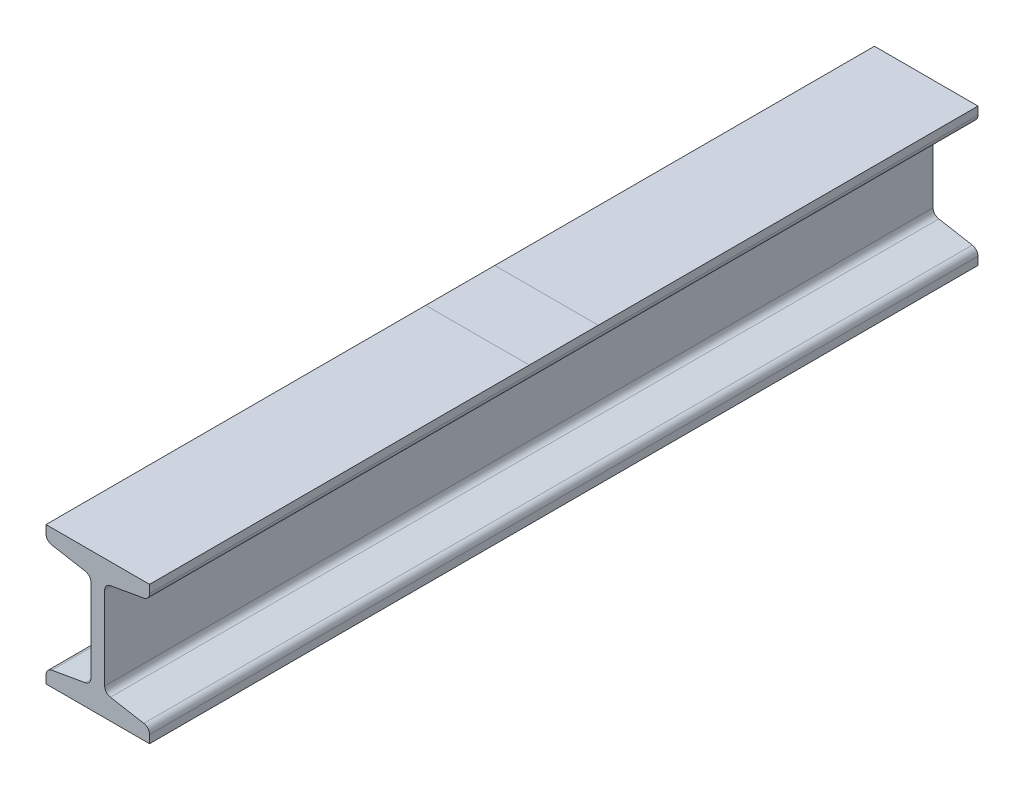
ISO-10303-21;
HEADER;
FILE_DESCRIPTION(('STEP AP214'),'2;1');
FILE_NAME('part.step','',(''),(''),'','','');
FILE_SCHEMA(('AUTOMOTIVE_DESIGN { 1 0 10303 214 1 1 1 1 }'));
ENDSEC;
DATA;
#1=APPLICATION_CONTEXT('core data for automotive mechanical design processes');
#2=APPLICATION_PROTOCOL_DEFINITION('international standard','automotive_design',2000,#1);
#3=PRODUCT_CONTEXT('',#1,'mechanical');
#4=PRODUCT('Part','Part','',(#3));
#5=PRODUCT_RELATED_PRODUCT_CATEGORY('part','',(#4));
#6=PRODUCT_DEFINITION_FORMATION('','',#4);
#7=PRODUCT_DEFINITION_CONTEXT('part definition',#1,'design');
#8=PRODUCT_DEFINITION('design','',#6,#7);
#9=PRODUCT_DEFINITION_SHAPE('','',#8);
#10=(LENGTH_UNIT() NAMED_UNIT(*) SI_UNIT(.MILLI.,.METRE.));
#11=(NAMED_UNIT(*) PLANE_ANGLE_UNIT() SI_UNIT($,.RADIAN.));
#12=(NAMED_UNIT(*) SI_UNIT($,.STERADIAN.) SOLID_ANGLE_UNIT());
#13=UNCERTAINTY_MEASURE_WITH_UNIT(LENGTH_MEASURE(1.E-05),#10,'distance_accuracy_value','');
#14=(GEOMETRIC_REPRESENTATION_CONTEXT(3) GLOBAL_UNCERTAINTY_ASSIGNED_CONTEXT((#13)) GLOBAL_UNIT_ASSIGNED_CONTEXT((#10,
#11,#12)) REPRESENTATION_CONTEXT('',''));
#15=CARTESIAN_POINT('',(0.,0.,0.));
#16=DIRECTION('',(0.,0.,1.));
#17=DIRECTION('',(1.,0.,0.));
#18=AXIS2_PLACEMENT_3D('',#15,#16,#17);
#19=CARTESIAN_POINT('',(37.5,-50.,600.));
#20=DIRECTION('',(0.,1.,0.));
#21=DIRECTION('',(0.,0.,1.));
#22=AXIS2_PLACEMENT_3D('',#19,#20,#21);
#23=PLANE('',#22);
#24=DIRECTION('',(-1.,0.,0.));
#25=VECTOR('',#24,1.);
#26=CARTESIAN_POINT('',(37.4999999999997,-50.,40.));
#27=LINE('',#26,#25);
#28=CARTESIAN_POINT('',(37.5,-50.,40.));
#29=VERTEX_POINT('',#28);
#30=CARTESIAN_POINT('',(-37.5,-50.,40.));
#31=VERTEX_POINT('',#30);
#32=EDGE_CURVE('E365',#29,#31,#27,.T.);
#33=ORIENTED_EDGE('',*,*,#32,.F.);
#34=DIRECTION('',(0.,0.,-1.));
#35=VECTOR('',#34,1.);
#36=CARTESIAN_POINT('',(37.5,-50.,600.));
#37=LINE('',#36,#35);
#38=CARTESIAN_POINT('',(37.5,-50.,560.));
#39=VERTEX_POINT('',#38);
#40=EDGE_CURVE('E274',#39,#29,#37,.T.);
#41=ORIENTED_EDGE('',*,*,#40,.F.);
#42=DIRECTION('',(1.,0.,0.));
#43=VECTOR('',#42,1.);
#44=CARTESIAN_POINT('',(37.5,-50.,560.));
#45=LINE('',#44,#43);
#46=CARTESIAN_POINT('',(-37.5,-50.,560.));
#47=VERTEX_POINT('',#46);
#48=EDGE_CURVE('E361',#47,#39,#45,.T.);
#49=ORIENTED_EDGE('',*,*,#48,.F.);
#50=DIRECTION('',(0.,0.,-1.));
#51=VECTOR('',#50,1.);
#52=CARTESIAN_POINT('',(-37.5,-50.,600.));
#53=LINE('',#52,#51);
#54=EDGE_CURVE('E256',#47,#31,#53,.T.);
#55=ORIENTED_EDGE('',*,*,#54,.T.);
#56=EDGE_LOOP('',(#33,#41,#49,#55));
#57=FACE_BOUND('',#56,.T.);
#58=ADVANCED_FACE('F51',(#57),#23,.F.);
#59=CARTESIAN_POINT('',(37.5,-50.,0.));
#60=VERTEX_POINT('',#59);
#61=EDGE_CURVE('E275',#29,#60,#37,.T.);
#62=ORIENTED_EDGE('',*,*,#61,.F.);
#63=ORIENTED_EDGE('',*,*,#32,.T.);
#64=CARTESIAN_POINT('',(-37.5,-50.,0.));
#65=VERTEX_POINT('',#64);
#66=EDGE_CURVE('E257',#31,#65,#53,.T.);
#67=ORIENTED_EDGE('',*,*,#66,.T.);
#68=DIRECTION('',(1.,0.,0.));
#69=VECTOR('',#68,1.);
#70=CARTESIAN_POINT('',(37.5,-50.,0.));
#71=LINE('',#70,#69);
#72=EDGE_CURVE('E328',#65,#60,#71,.T.);
#73=ORIENTED_EDGE('',*,*,#72,.T.);
#74=EDGE_LOOP('',(#62,#63,#67,#73));
#75=FACE_BOUND('',#74,.T.);
#76=ADVANCED_FACE('F543',(#75),#23,.F.);
#77=CARTESIAN_POINT('',(-37.5,50.,600.));
#78=DIRECTION('',(0.,-1.,0.));
#79=DIRECTION('',(0.,0.,-1.));
#80=AXIS2_PLACEMENT_3D('',#77,#78,#79);
#81=PLANE('',#80);
#82=DIRECTION('',(-1.,0.,0.));
#83=VECTOR('',#82,1.);
#84=CARTESIAN_POINT('',(-37.5,50.,275.));
#85=LINE('',#84,#83);
#86=CARTESIAN_POINT('',(37.5,50.,275.));
#87=VERTEX_POINT('',#86);
#88=CARTESIAN_POINT('',(-37.5,50.,275.));
#89=VERTEX_POINT('',#88);
#90=EDGE_CURVE('E247',#87,#89,#85,.T.);
#91=ORIENTED_EDGE('',*,*,#90,.F.);
#92=DIRECTION('',(0.,0.,-1.));
#93=VECTOR('',#92,1.);
#94=CARTESIAN_POINT('',(37.5,50.,600.));
#95=LINE('',#94,#93);
#96=CARTESIAN_POINT('',(37.5,50.,0.));
#97=VERTEX_POINT('',#96);
#98=EDGE_CURVE('E289',#87,#97,#95,.T.);
#99=ORIENTED_EDGE('',*,*,#98,.T.);
#100=DIRECTION('',(-1.,0.,0.));
#101=VECTOR('',#100,1.);
#102=CARTESIAN_POINT('',(-37.5,50.,0.));
#103=LINE('',#102,#101);
#104=CARTESIAN_POINT('',(-37.5,50.,0.));
#105=VERTEX_POINT('',#104);
#106=EDGE_CURVE('E307',#97,#105,#103,.T.);
#107=ORIENTED_EDGE('',*,*,#106,.T.);
#108=DIRECTION('',(0.,0.,-1.));
#109=VECTOR('',#108,1.);
#110=CARTESIAN_POINT('',(-37.5,50.,600.));
#111=LINE('',#110,#109);
#112=EDGE_CURVE('E244',#89,#105,#111,.T.);
#113=ORIENTED_EDGE('',*,*,#112,.F.);
#114=EDGE_LOOP('',(#91,#99,#107,#113));
#115=FACE_BOUND('',#114,.T.);
#116=ADVANCED_FACE('F357',(#115),#81,.F.);
#117=DIRECTION('',(1.,0.,0.));
#118=VECTOR('',#117,1.);
#119=CARTESIAN_POINT('',(-37.5,50.,325.));
#120=LINE('',#119,#118);
#121=CARTESIAN_POINT('',(-37.5,50.,325.));
#122=VERTEX_POINT('',#121);
#123=CARTESIAN_POINT('',(37.5,50.,325.));
#124=VERTEX_POINT('',#123);
#125=EDGE_CURVE('E239',#122,#124,#120,.T.);
#126=ORIENTED_EDGE('',*,*,#125,.F.);
#127=CARTESIAN_POINT('',(-37.5,50.,600.));
#128=VERTEX_POINT('',#127);
#129=EDGE_CURVE('E220',#128,#122,#111,.T.);
#130=ORIENTED_EDGE('',*,*,#129,.F.);
#131=DIRECTION('',(-1.,0.,0.));
#132=VECTOR('',#131,1.);
#133=CARTESIAN_POINT('',(-37.5,50.,600.));
#134=LINE('',#133,#132);
#135=CARTESIAN_POINT('',(37.5,50.,600.));
#136=VERTEX_POINT('',#135);
#137=EDGE_CURVE('E226',#136,#128,#134,.T.);
#138=ORIENTED_EDGE('',*,*,#137,.F.);
#139=EDGE_CURVE('E284',#136,#124,#95,.T.);
#140=ORIENTED_EDGE('',*,*,#139,.T.);
#141=EDGE_LOOP('',(#126,#130,#138,#140));
#142=FACE_BOUND('',#141,.T.);
#143=ADVANCED_FACE('F238',(#142),#81,.F.);
#144=EDGE_CURVE('E288',#124,#87,#95,.T.);
#145=ORIENTED_EDGE('',*,*,#144,.T.);
#146=ORIENTED_EDGE('',*,*,#90,.T.);
#147=EDGE_CURVE('E242',#122,#89,#111,.T.);
#148=ORIENTED_EDGE('',*,*,#147,.F.);
#149=ORIENTED_EDGE('',*,*,#125,.T.);
#150=EDGE_LOOP('',(#145,#146,#148,#149));
#151=FACE_BOUND('',#150,.T.);
#152=ADVANCED_FACE('F359',(#151),#81,.F.);
#153=CARTESIAN_POINT('',(-37.5,50.,600.));
#154=DIRECTION('',(1.,0.,0.));
#155=DIRECTION('',(0.,1.,0.));
#156=AXIS2_PLACEMENT_3D('',#153,#154,#155);
#157=PLANE('',#156);
#158=DIRECTION('',(0.,-1.,0.));
#159=VECTOR('',#158,1.);
#160=CARTESIAN_POINT('',(-37.5,50.,0.));
#161=LINE('',#160,#159);
#162=CARTESIAN_POINT('',(-37.5,44.1954981558864,0.));
#163=VERTEX_POINT('',#162);
#164=EDGE_CURVE('E310',#105,#163,#161,.T.);
#165=ORIENTED_EDGE('',*,*,#164,.T.);
#166=DIRECTION('',(0.,0.,-1.));
#167=VECTOR('',#166,1.);
#168=CARTESIAN_POINT('',(-37.5,44.1954981558864,600.));
#169=LINE('',#168,#167);
#170=CARTESIAN_POINT('',(-37.5,44.1954981558864,600.));
#171=VERTEX_POINT('',#170);
#172=EDGE_CURVE('E222',#163,#171,#169,.F.);
#173=ORIENTED_EDGE('',*,*,#172,.T.);
#174=DIRECTION('',(0.,-1.,0.));
#175=VECTOR('',#174,1.);
#176=CARTESIAN_POINT('',(-37.5,50.,600.));
#177=LINE('',#176,#175);
#178=EDGE_CURVE('E214',#128,#171,#177,.T.);
#179=ORIENTED_EDGE('',*,*,#178,.F.);
#180=ORIENTED_EDGE('',*,*,#129,.T.);
#181=ORIENTED_EDGE('',*,*,#147,.T.);
#182=ORIENTED_EDGE('',*,*,#112,.T.);
#183=EDGE_LOOP('',(#165,#173,#179,#180,#181,#182));
#184=FACE_BOUND('',#183,.T.);
#185=ADVANCED_FACE('F217',(#184),#157,.F.);
#186=CARTESIAN_POINT('',(-37.5,40.,600.));
#187=DIRECTION('',(0.173648177666926,0.984807753012209,0.));
#188=DIRECTION('',(-0.984807753012209,0.173648177666926,0.));
#189=AXIS2_PLACEMENT_3D('',#186,#187,#188);
#190=PLANE('',#189);
#191=DIRECTION('',(0.984807753012209,-0.173648177666926,0.));
#192=VECTOR('',#191,1.);
#193=CARTESIAN_POINT('',(-37.5,40.,0.));
#194=LINE('',#193,#192);
#195=CARTESIAN_POINT('',(-33.3682408883346,39.2714593908254,0.));
#196=VERTEX_POINT('',#195);
#197=CARTESIAN_POINT('',(-9.13175911166537,34.9979137361497,0.));
#198=VERTEX_POINT('',#197);
#199=EDGE_CURVE('E313',#196,#198,#194,.T.);
#200=ORIENTED_EDGE('',*,*,#199,.T.);
#201=DIRECTION('',(0.,0.,-1.));
#202=VECTOR('',#201,1.);
#203=CARTESIAN_POINT('',(-9.13175911166537,34.9979137361497,600.));
#204=LINE('',#203,#202);
#205=CARTESIAN_POINT('',(-9.13175911166537,34.9979137361497,600.));
#206=VERTEX_POINT('',#205);
#207=EDGE_CURVE('E445',#198,#206,#204,.F.);
#208=ORIENTED_EDGE('',*,*,#207,.T.);
#209=DIRECTION('',(0.984807753012209,-0.173648177666926,0.));
#210=VECTOR('',#209,1.);
#211=CARTESIAN_POINT('',(-37.5,40.,600.));
#212=LINE('',#211,#210);
#213=CARTESIAN_POINT('',(-33.3682408883346,39.2714593908254,600.));
#214=VERTEX_POINT('',#213);
#215=EDGE_CURVE('E225',#214,#206,#212,.T.);
#216=ORIENTED_EDGE('',*,*,#215,.F.);
#217=DIRECTION('',(0.,0.,-1.));
#218=VECTOR('',#217,1.);
#219=CARTESIAN_POINT('',(-33.3682408883346,39.2714593908254,600.));
#220=LINE('',#219,#218);
#221=EDGE_CURVE('E441',#214,#196,#220,.T.);
#222=ORIENTED_EDGE('',*,*,#221,.T.);
#223=EDGE_LOOP('',(#200,#208,#216,#222));
#224=FACE_BOUND('',#223,.T.);
#225=ADVANCED_FACE('F476',(#224),#190,.F.);
#226=CARTESIAN_POINT('',(-5.,34.269373126975,600.));
#227=DIRECTION('',(1.,0.,0.));
#228=DIRECTION('',(0.,1.,0.));
#229=AXIS2_PLACEMENT_3D('',#226,#227,#228);
#230=PLANE('',#229);
#231=DIRECTION('',(0.,-1.,0.));
#232=VECTOR('',#231,1.);
#233=CARTESIAN_POINT('',(-5.,34.269373126975,0.));
#234=LINE('',#233,#232);
#235=CARTESIAN_POINT('',(-5.,30.0738749710886,0.));
#236=VERTEX_POINT('',#235);
#237=CARTESIAN_POINT('',(-4.99999999999999,-30.0738749710886,0.));
#238=VERTEX_POINT('',#237);
#239=EDGE_CURVE('E317',#236,#238,#234,.T.);
#240=ORIENTED_EDGE('',*,*,#239,.T.);
#241=DIRECTION('',(0.,0.,-1.));
#242=VECTOR('',#241,1.);
#243=CARTESIAN_POINT('',(-4.99999999999999,-30.0738749710886,600.));
#244=LINE('',#243,#242);
#245=CARTESIAN_POINT('',(-4.99999999999999,-30.0738749710886,600.));
#246=VERTEX_POINT('',#245);
#247=EDGE_CURVE('E415',#238,#246,#244,.F.);
#248=ORIENTED_EDGE('',*,*,#247,.T.);
#249=DIRECTION('',(0.,-1.,0.));
#250=VECTOR('',#249,1.);
#251=CARTESIAN_POINT('',(-5.,34.269373126975,600.));
#252=LINE('',#251,#250);
#253=CARTESIAN_POINT('',(-5.,30.0738749710886,600.));
#254=VERTEX_POINT('',#253);
#255=EDGE_CURVE('E484',#254,#246,#252,.T.);
#256=ORIENTED_EDGE('',*,*,#255,.F.);
#257=DIRECTION('',(0.,0.,-1.));
#258=VECTOR('',#257,1.);
#259=CARTESIAN_POINT('',(-5.,30.0738749710886,2.22044604925031E-13));
#260=LINE('',#259,#258);
#261=EDGE_CURVE('E411',#254,#236,#260,.T.);
#262=ORIENTED_EDGE('',*,*,#261,.T.);
#263=EDGE_LOOP('',(#240,#248,#256,#262));
#264=FACE_BOUND('',#263,.T.);
#265=ADVANCED_FACE('F487',(#264),#230,.F.);
#266=CARTESIAN_POINT('',(-4.99999999999999,-34.269373126975,600.));
#267=DIRECTION('',(0.173648177666926,-0.984807753012209,0.));
#268=DIRECTION('',(0.984807753012209,0.173648177666926,0.));
#269=AXIS2_PLACEMENT_3D('',#266,#267,#268);
#270=PLANE('',#269);
#271=DIRECTION('',(-0.984807753012209,-0.173648177666926,0.));
#272=VECTOR('',#271,1.);
#273=CARTESIAN_POINT('',(-4.99999999999999,-34.269373126975,0.));
#274=LINE('',#273,#272);
#275=CARTESIAN_POINT('',(-9.13175911166536,-34.9979137361497,0.));
#276=VERTEX_POINT('',#275);
#277=CARTESIAN_POINT('',(-33.3682408883346,-39.2714593908254,0.));
#278=VERTEX_POINT('',#277);
#279=EDGE_CURVE('E321',#276,#278,#274,.T.);
#280=ORIENTED_EDGE('',*,*,#279,.T.);
#281=DIRECTION('',(0.,0.,-1.));
#282=VECTOR('',#281,1.);
#283=CARTESIAN_POINT('',(-33.3682408883346,-39.2714593908254,600.));
#284=LINE('',#283,#282);
#285=CARTESIAN_POINT('',(-33.3682408883346,-39.2714593908254,600.));
#286=VERTEX_POINT('',#285);
#287=EDGE_CURVE('E397',#278,#286,#284,.F.);
#288=ORIENTED_EDGE('',*,*,#287,.T.);
#289=DIRECTION('',(-0.984807753012209,-0.173648177666926,0.));
#290=VECTOR('',#289,1.);
#291=CARTESIAN_POINT('',(-4.99999999999999,-34.269373126975,600.));
#292=LINE('',#291,#290);
#293=CARTESIAN_POINT('',(-9.13175911166536,-34.9979137361497,600.));
#294=VERTEX_POINT('',#293);
#295=EDGE_CURVE('E490',#294,#286,#292,.T.);
#296=ORIENTED_EDGE('',*,*,#295,.F.);
#297=DIRECTION('',(0.,0.,-1.));
#298=VECTOR('',#297,1.);
#299=CARTESIAN_POINT('',(-9.13175911166536,-34.9979137361497,0.));
#300=LINE('',#299,#298);
#301=EDGE_CURVE('E393',#294,#276,#300,.T.);
#302=ORIENTED_EDGE('',*,*,#301,.T.);
#303=EDGE_LOOP('',(#280,#288,#296,#302));
#304=FACE_BOUND('',#303,.T.);
#305=ADVANCED_FACE('F554',(#304),#270,.F.);
#306=CARTESIAN_POINT('',(-37.5,-40.,600.));
#307=DIRECTION('',(1.,0.,0.));
#308=DIRECTION('',(0.,0.,-1.));
#309=AXIS2_PLACEMENT_3D('',#306,#307,#308);
#310=PLANE('',#309);
#311=DIRECTION('',(0.,-1.,0.));
#312=VECTOR('',#311,1.);
#313=CARTESIAN_POINT('',(-37.5,-40.,600.));
#314=LINE('',#313,#312);
#315=CARTESIAN_POINT('',(-37.5,-44.1954981558864,600.));
#316=VERTEX_POINT('',#315);
#317=CARTESIAN_POINT('',(-37.5,-50.,600.));
#318=VERTEX_POINT('',#317);
#319=EDGE_CURVE('E494',#316,#318,#314,.T.);
#320=ORIENTED_EDGE('',*,*,#319,.F.);
#321=DIRECTION('',(0.,0.,-1.));
#322=VECTOR('',#321,1.);
#323=CARTESIAN_POINT('',(-37.5,-44.1954981558864,600.));
#324=LINE('',#323,#322);
#325=CARTESIAN_POINT('',(-37.5,-44.1954981558864,0.));
#326=VERTEX_POINT('',#325);
#327=EDGE_CURVE('E378',#316,#326,#324,.T.);
#328=ORIENTED_EDGE('',*,*,#327,.T.);
#329=DIRECTION('',(0.,-1.,0.));
#330=VECTOR('',#329,1.);
#331=CARTESIAN_POINT('',(-37.5,-40.,0.));
#332=LINE('',#331,#330);
#333=EDGE_CURVE('E325',#326,#65,#332,.T.);
#334=ORIENTED_EDGE('',*,*,#333,.T.);
#335=ORIENTED_EDGE('',*,*,#66,.F.);
#336=ORIENTED_EDGE('',*,*,#54,.F.);
#337=EDGE_CURVE('E251',#318,#47,#53,.T.);
#338=ORIENTED_EDGE('',*,*,#337,.F.);
#339=EDGE_LOOP('',(#320,#328,#334,#335,#336,#338));
#340=FACE_BOUND('',#339,.T.);
#341=ADVANCED_FACE('F546',(#340),#310,.F.);
#342=ORIENTED_EDGE('',*,*,#337,.T.);
#343=ORIENTED_EDGE('',*,*,#48,.T.);
#344=CARTESIAN_POINT('',(37.5,-50.,600.));
#345=VERTEX_POINT('',#344);
#346=EDGE_CURVE('E267',#345,#39,#37,.T.);
#347=ORIENTED_EDGE('',*,*,#346,.F.);
#348=DIRECTION('',(1.,0.,0.));
#349=VECTOR('',#348,1.);
#350=CARTESIAN_POINT('',(37.5,-50.,600.));
#351=LINE('',#350,#349);
#352=EDGE_CURVE('E500',#318,#345,#351,.T.);
#353=ORIENTED_EDGE('',*,*,#352,.F.);
#354=EDGE_LOOP('',(#342,#343,#347,#353));
#355=FACE_BOUND('',#354,.T.);
#356=ADVANCED_FACE('F539',(#355),#23,.F.);
#357=CARTESIAN_POINT('',(37.5,-40.,600.));
#358=DIRECTION('',(-1.,0.,0.));
#359=DIRECTION('',(0.,-1.,0.));
#360=AXIS2_PLACEMENT_3D('',#357,#358,#359);
#361=PLANE('',#360);
#362=DIRECTION('',(0.,1.,0.));
#363=VECTOR('',#362,1.);
#364=CARTESIAN_POINT('',(37.5,-40.,0.));
#365=LINE('',#364,#363);
#366=CARTESIAN_POINT('',(37.5,-44.1954981558864,0.));
#367=VERTEX_POINT('',#366);
#368=EDGE_CURVE('E331',#60,#367,#365,.T.);
#369=ORIENTED_EDGE('',*,*,#368,.T.);
#370=DIRECTION('',(0.,0.,-1.));
#371=VECTOR('',#370,1.);
#372=CARTESIAN_POINT('',(37.5,-44.1954981558864,600.));
#373=LINE('',#372,#371);
#374=CARTESIAN_POINT('',(37.5,-44.1954981558864,600.));
#375=VERTEX_POINT('',#374);
#376=EDGE_CURVE('E425',#367,#375,#373,.F.);
#377=ORIENTED_EDGE('',*,*,#376,.T.);
#378=DIRECTION('',(0.,1.,0.));
#379=VECTOR('',#378,1.);
#380=CARTESIAN_POINT('',(37.5,-40.,600.));
#381=LINE('',#380,#379);
#382=EDGE_CURVE('E503',#345,#375,#381,.T.);
#383=ORIENTED_EDGE('',*,*,#382,.F.);
#384=ORIENTED_EDGE('',*,*,#346,.T.);
#385=ORIENTED_EDGE('',*,*,#40,.T.);
#386=ORIENTED_EDGE('',*,*,#61,.T.);
#387=EDGE_LOOP('',(#369,#377,#383,#384,#385,#386));
#388=FACE_BOUND('',#387,.T.);
#389=ADVANCED_FACE('F537',(#388),#361,.F.);
#390=CARTESIAN_POINT('',(5.00000000000001,-34.269373126975,600.));
#391=DIRECTION('',(-0.173648177666926,-0.984807753012209,0.));
#392=DIRECTION('',(0.984807753012209,-0.173648177666926,0.));
#393=AXIS2_PLACEMENT_3D('',#390,#391,#392);
#394=PLANE('',#393);
#395=DIRECTION('',(-0.984807753012209,0.173648177666926,0.));
#396=VECTOR('',#395,1.);
#397=CARTESIAN_POINT('',(5.00000000000001,-34.269373126975,600.));
#398=LINE('',#397,#396);
#399=CARTESIAN_POINT('',(33.3682408883346,-39.2714593908254,600.));
#400=VERTEX_POINT('',#399);
#401=CARTESIAN_POINT('',(9.13175911166538,-34.9979137361497,600.));
#402=VERTEX_POINT('',#401);
#403=EDGE_CURVE('E507',#400,#402,#398,.T.);
#404=ORIENTED_EDGE('',*,*,#403,.F.);
#405=DIRECTION('',(0.,0.,-1.));
#406=VECTOR('',#405,1.);
#407=CARTESIAN_POINT('',(33.3682408883346,-39.2714593908254,600.));
#408=LINE('',#407,#406);
#409=CARTESIAN_POINT('',(33.3682408883346,-39.2714593908254,0.));
#410=VERTEX_POINT('',#409);
#411=EDGE_CURVE('E421',#400,#410,#408,.T.);
#412=ORIENTED_EDGE('',*,*,#411,.T.);
#413=DIRECTION('',(-0.984807753012209,0.173648177666926,0.));
#414=VECTOR('',#413,1.);
#415=CARTESIAN_POINT('',(5.00000000000001,-34.269373126975,0.));
#416=LINE('',#415,#414);
#417=CARTESIAN_POINT('',(9.13175911166538,-34.9979137361497,0.));
#418=VERTEX_POINT('',#417);
#419=EDGE_CURVE('E334',#410,#418,#416,.T.);
#420=ORIENTED_EDGE('',*,*,#419,.T.);
#421=DIRECTION('',(0.,0.,-1.));
#422=VECTOR('',#421,1.);
#423=CARTESIAN_POINT('',(9.13175911166538,-34.9979137361497,600.));
#424=LINE('',#423,#422);
#425=EDGE_CURVE('E418',#418,#402,#424,.F.);
#426=ORIENTED_EDGE('',*,*,#425,.T.);
#427=EDGE_LOOP('',(#404,#412,#420,#426));
#428=FACE_BOUND('',#427,.T.);
#429=ADVANCED_FACE('F530',(#428),#394,.F.);
#430=CARTESIAN_POINT('',(5.,34.269373126975,600.));
#431=DIRECTION('',(-1.,0.,0.));
#432=DIRECTION('',(0.,-1.,0.));
#433=AXIS2_PLACEMENT_3D('',#430,#431,#432);
#434=PLANE('',#433);
#435=DIRECTION('',(0.,1.,0.));
#436=VECTOR('',#435,1.);
#437=CARTESIAN_POINT('',(5.,34.269373126975,600.));
#438=LINE('',#437,#436);
#439=CARTESIAN_POINT('',(5.00000000000001,-30.0738749710886,600.));
#440=VERTEX_POINT('',#439);
#441=CARTESIAN_POINT('',(5.,30.0738749710886,600.));
#442=VERTEX_POINT('',#441);
#443=EDGE_CURVE('E303',#440,#442,#438,.T.);
#444=ORIENTED_EDGE('',*,*,#443,.F.);
#445=DIRECTION('',(0.,0.,-1.));
#446=VECTOR('',#445,1.);
#447=CARTESIAN_POINT('',(5.00000000000001,-30.0738749710886,2.22044604925031E-13));
#448=LINE('',#447,#446);
#449=CARTESIAN_POINT('',(5.00000000000001,-30.0738749710886,0.));
#450=VERTEX_POINT('',#449);
#451=EDGE_CURVE('E431',#440,#450,#448,.T.);
#452=ORIENTED_EDGE('',*,*,#451,.T.);
#453=DIRECTION('',(0.,1.,0.));
#454=VECTOR('',#453,1.);
#455=CARTESIAN_POINT('',(5.,34.269373126975,0.));
#456=LINE('',#455,#454);
#457=CARTESIAN_POINT('',(5.,30.0738749710886,0.));
#458=VERTEX_POINT('',#457);
#459=EDGE_CURVE('E338',#450,#458,#456,.T.);
#460=ORIENTED_EDGE('',*,*,#459,.T.);
#461=DIRECTION('',(0.,0.,-1.));
#462=VECTOR('',#461,1.);
#463=CARTESIAN_POINT('',(5.,30.0738749710886,600.));
#464=LINE('',#463,#462);
#465=EDGE_CURVE('E428',#458,#442,#464,.F.);
#466=ORIENTED_EDGE('',*,*,#465,.T.);
#467=EDGE_LOOP('',(#444,#452,#460,#466));
#468=FACE_BOUND('',#467,.T.);
#469=ADVANCED_FACE('F523',(#468),#434,.F.);
#470=CARTESIAN_POINT('',(37.5,40.,600.));
#471=DIRECTION('',(-0.173648177666926,0.984807753012209,0.));
#472=DIRECTION('',(-0.984807753012209,-0.173648177666926,0.));
#473=AXIS2_PLACEMENT_3D('',#470,#471,#472);
#474=PLANE('',#473);
#475=DIRECTION('',(0.984807753012209,0.173648177666926,0.));
#476=VECTOR('',#475,1.);
#477=CARTESIAN_POINT('',(37.5,40.,600.));
#478=LINE('',#477,#476);
#479=CARTESIAN_POINT('',(9.13175911166537,34.9979137361497,600.));
#480=VERTEX_POINT('',#479);
#481=CARTESIAN_POINT('',(33.3682408883346,39.2714593908254,600.));
#482=VERTEX_POINT('',#481);
#483=EDGE_CURVE('E300',#480,#482,#478,.T.);
#484=ORIENTED_EDGE('',*,*,#483,.F.);
#485=DIRECTION('',(0.,0.,-1.));
#486=VECTOR('',#485,1.);
#487=CARTESIAN_POINT('',(9.13175911166537,34.9979137361497,0.));
#488=LINE('',#487,#486);
#489=CARTESIAN_POINT('',(9.13175911166537,34.9979137361497,0.));
#490=VERTEX_POINT('',#489);
#491=EDGE_CURVE('E437',#480,#490,#488,.T.);
#492=ORIENTED_EDGE('',*,*,#491,.T.);
#493=DIRECTION('',(0.984807753012209,0.173648177666926,0.));
#494=VECTOR('',#493,1.);
#495=CARTESIAN_POINT('',(37.5,40.,0.));
#496=LINE('',#495,#494);
#497=CARTESIAN_POINT('',(33.3682408883346,39.2714593908254,0.));
#498=VERTEX_POINT('',#497);
#499=EDGE_CURVE('E342',#490,#498,#496,.T.);
#500=ORIENTED_EDGE('',*,*,#499,.T.);
#501=DIRECTION('',(0.,0.,-1.));
#502=VECTOR('',#501,1.);
#503=CARTESIAN_POINT('',(33.3682408883346,39.2714593908254,600.));
#504=LINE('',#503,#502);
#505=EDGE_CURVE('E75',#498,#482,#504,.F.);
#506=ORIENTED_EDGE('',*,*,#505,.T.);
#507=EDGE_LOOP('',(#484,#492,#500,#506));
#508=FACE_BOUND('',#507,.T.);
#509=ADVANCED_FACE('F521',(#508),#474,.F.);
#510=CARTESIAN_POINT('',(37.5,50.,600.));
#511=DIRECTION('',(-1.,0.,0.));
#512=DIRECTION('',(0.,-1.,0.));
#513=AXIS2_PLACEMENT_3D('',#510,#511,#512);
#514=PLANE('',#513);
#515=DIRECTION('',(0.,1.,0.));
#516=VECTOR('',#515,1.);
#517=CARTESIAN_POINT('',(37.5,50.,600.));
#518=LINE('',#517,#516);
#519=CARTESIAN_POINT('',(37.5,44.1954981558864,600.));
#520=VERTEX_POINT('',#519);
#521=EDGE_CURVE('E231',#520,#136,#518,.T.);
#522=ORIENTED_EDGE('',*,*,#521,.F.);
#523=DIRECTION('',(0.,0.,-1.));
#524=VECTOR('',#523,1.);
#525=CARTESIAN_POINT('',(37.5,44.1954981558864,600.));
#526=LINE('',#525,#524);
#527=CARTESIAN_POINT('',(37.5,44.1954981558864,0.));
#528=VERTEX_POINT('',#527);
#529=EDGE_CURVE('E351',#520,#528,#526,.T.);
#530=ORIENTED_EDGE('',*,*,#529,.T.);
#531=DIRECTION('',(0.,1.,0.));
#532=VECTOR('',#531,1.);
#533=CARTESIAN_POINT('',(37.5,50.,0.));
#534=LINE('',#533,#532);
#535=EDGE_CURVE('E236',#528,#97,#534,.T.);
#536=ORIENTED_EDGE('',*,*,#535,.T.);
#537=ORIENTED_EDGE('',*,*,#98,.F.);
#538=ORIENTED_EDGE('',*,*,#144,.F.);
#539=ORIENTED_EDGE('',*,*,#139,.F.);
#540=EDGE_LOOP('',(#522,#530,#536,#537,#538,#539));
#541=FACE_BOUND('',#540,.T.);
#542=ADVANCED_FACE('F348',(#541),#514,.F.);
#543=CARTESIAN_POINT('',(0.,0.,600.));
#544=DIRECTION('',(0.,0.,-1.));
#545=DIRECTION('',(-1.,0.,0.));
#546=AXIS2_PLACEMENT_3D('',#543,#544,#545);
#547=PLANE('',#546);
#548=ORIENTED_EDGE('',*,*,#295,.T.);
#549=CARTESIAN_POINT('',(-32.5,-44.1954981558864,600.));
#550=DIRECTION('',(0.,0.,-1.));
#551=DIRECTION('',(-1.,0.,0.));
#552=AXIS2_PLACEMENT_3D('',#549,#550,#551);
#553=CIRCLE('',#552,5.);
#554=EDGE_CURVE('E408',#286,#316,#553,.F.);
#555=ORIENTED_EDGE('',*,*,#554,.T.);
#556=ORIENTED_EDGE('',*,*,#319,.T.);
#557=ORIENTED_EDGE('',*,*,#352,.T.);
#558=ORIENTED_EDGE('',*,*,#382,.T.);
#559=CARTESIAN_POINT('',(32.5,-44.1954981558864,600.));
#560=DIRECTION('',(0.,0.,-1.));
#561=DIRECTION('',(-1.,0.,0.));
#562=AXIS2_PLACEMENT_3D('',#559,#560,#561);
#563=CIRCLE('',#562,5.);
#564=EDGE_CURVE('E405',#375,#400,#563,.F.);
#565=ORIENTED_EDGE('',*,*,#564,.T.);
#566=ORIENTED_EDGE('',*,*,#403,.T.);
#567=CARTESIAN_POINT('',(10.,-30.0738749710886,600.));
#568=DIRECTION('',(0.,0.,-1.));
#569=DIRECTION('',(-1.,0.,0.));
#570=AXIS2_PLACEMENT_3D('',#567,#568,#569);
#571=CIRCLE('',#570,5.);
#572=EDGE_CURVE('E461',#402,#440,#571,.T.);
#573=ORIENTED_EDGE('',*,*,#572,.T.);
#574=ORIENTED_EDGE('',*,*,#443,.T.);
#575=CARTESIAN_POINT('',(10.,30.0738749710886,600.));
#576=DIRECTION('',(0.,0.,-1.));
#577=DIRECTION('',(-1.,0.,0.));
#578=AXIS2_PLACEMENT_3D('',#575,#576,#577);
#579=CIRCLE('',#578,5.);
#580=EDGE_CURVE('E467',#442,#480,#579,.T.);
#581=ORIENTED_EDGE('',*,*,#580,.T.);
#582=ORIENTED_EDGE('',*,*,#483,.T.);
#583=CARTESIAN_POINT('',(32.5,44.1954981558864,600.));
#584=DIRECTION('',(0.,0.,-1.));
#585=DIRECTION('',(-1.,0.,0.));
#586=AXIS2_PLACEMENT_3D('',#583,#584,#585);
#587=CIRCLE('',#586,5.);
#588=EDGE_CURVE('E67',#482,#520,#587,.F.);
#589=ORIENTED_EDGE('',*,*,#588,.T.);
#590=ORIENTED_EDGE('',*,*,#521,.T.);
#591=ORIENTED_EDGE('',*,*,#137,.T.);
#592=ORIENTED_EDGE('',*,*,#178,.T.);
#593=CARTESIAN_POINT('',(-32.5,44.1954981558864,600.));
#594=DIRECTION('',(0.,0.,-1.));
#595=DIRECTION('',(-1.,0.,0.));
#596=AXIS2_PLACEMENT_3D('',#593,#594,#595);
#597=CIRCLE('',#596,5.);
#598=EDGE_CURVE('E402',#171,#214,#597,.F.);
#599=ORIENTED_EDGE('',*,*,#598,.T.);
#600=ORIENTED_EDGE('',*,*,#215,.T.);
#601=CARTESIAN_POINT('',(-10.,30.0738749710886,600.));
#602=DIRECTION('',(0.,0.,-1.));
#603=DIRECTION('',(-1.,0.,0.));
#604=AXIS2_PLACEMENT_3D('',#601,#602,#603);
#605=CIRCLE('',#604,5.);
#606=EDGE_CURVE('E12',#206,#254,#605,.T.);
#607=ORIENTED_EDGE('',*,*,#606,.T.);
#608=ORIENTED_EDGE('',*,*,#255,.T.);
#609=CARTESIAN_POINT('',(-9.99999999999999,-30.0738749710886,600.));
#610=DIRECTION('',(0.,0.,-1.));
#611=DIRECTION('',(-1.,0.,0.));
#612=AXIS2_PLACEMENT_3D('',#609,#610,#611);
#613=CIRCLE('',#612,5.);
#614=EDGE_CURVE('E455',#246,#294,#613,.T.);
#615=ORIENTED_EDGE('',*,*,#614,.T.);
#616=EDGE_LOOP('',(#548,#555,#556,#557,#558,#565,#566,#573,#574,#581,#582,#589,#590,#591,#592,
#599,#600,#607,#608,#615));
#617=FACE_BOUND('',#616,.T.);
#618=ADVANCED_FACE('F230',(#617),#547,.F.);
#619=CARTESIAN_POINT('',(0.,0.,0.));
#620=DIRECTION('',(0.,0.,-1.));
#621=DIRECTION('',(-1.,0.,0.));
#622=AXIS2_PLACEMENT_3D('',#619,#620,#621);
#623=PLANE('',#622);
#624=ORIENTED_EDGE('',*,*,#333,.F.);
#625=CARTESIAN_POINT('',(-32.5,-44.1954981558864,0.));
#626=DIRECTION('',(0.,0.,-1.));
#627=DIRECTION('',(-1.,0.,0.));
#628=AXIS2_PLACEMENT_3D('',#625,#626,#627);
#629=CIRCLE('',#628,5.);
#630=EDGE_CURVE('E390',#326,#278,#629,.T.);
#631=ORIENTED_EDGE('',*,*,#630,.T.);
#632=ORIENTED_EDGE('',*,*,#279,.F.);
#633=CARTESIAN_POINT('',(-9.99999999999999,-30.0738749710886,0.));
#634=DIRECTION('',(0.,0.,-1.));
#635=DIRECTION('',(-1.,0.,0.));
#636=AXIS2_PLACEMENT_3D('',#633,#634,#635);
#637=CIRCLE('',#636,5.);
#638=EDGE_CURVE('E452',#276,#238,#637,.F.);
#639=ORIENTED_EDGE('',*,*,#638,.T.);
#640=ORIENTED_EDGE('',*,*,#239,.F.);
#641=CARTESIAN_POINT('',(-10.,30.0738749710886,0.));
#642=DIRECTION('',(0.,0.,-1.));
#643=DIRECTION('',(-1.,0.,0.));
#644=AXIS2_PLACEMENT_3D('',#641,#642,#643);
#645=CIRCLE('',#644,5.);
#646=EDGE_CURVE('E60',#236,#198,#645,.F.);
#647=ORIENTED_EDGE('',*,*,#646,.T.);
#648=ORIENTED_EDGE('',*,*,#199,.F.);
#649=CARTESIAN_POINT('',(-32.5,44.1954981558864,0.));
#650=DIRECTION('',(0.,0.,-1.));
#651=DIRECTION('',(-1.,0.,0.));
#652=AXIS2_PLACEMENT_3D('',#649,#650,#651);
#653=CIRCLE('',#652,5.);
#654=EDGE_CURVE('E384',#196,#163,#653,.T.);
#655=ORIENTED_EDGE('',*,*,#654,.T.);
#656=ORIENTED_EDGE('',*,*,#164,.F.);
#657=ORIENTED_EDGE('',*,*,#106,.F.);
#658=ORIENTED_EDGE('',*,*,#535,.F.);
#659=CARTESIAN_POINT('',(32.5,44.1954981558864,0.));
#660=DIRECTION('',(0.,0.,-1.));
#661=DIRECTION('',(-1.,0.,0.));
#662=AXIS2_PLACEMENT_3D('',#659,#660,#661);
#663=CIRCLE('',#662,5.);
#664=EDGE_CURVE('E356',#528,#498,#663,.T.);
#665=ORIENTED_EDGE('',*,*,#664,.T.);
#666=ORIENTED_EDGE('',*,*,#499,.F.);
#667=CARTESIAN_POINT('',(10.,30.0738749710886,0.));
#668=DIRECTION('',(0.,0.,-1.));
#669=DIRECTION('',(-1.,0.,0.));
#670=AXIS2_PLACEMENT_3D('',#667,#668,#669);
#671=CIRCLE('',#670,5.);
#672=EDGE_CURVE('E464',#490,#458,#671,.F.);
#673=ORIENTED_EDGE('',*,*,#672,.T.);
#674=ORIENTED_EDGE('',*,*,#459,.F.);
#675=CARTESIAN_POINT('',(10.,-30.0738749710886,0.));
#676=DIRECTION('',(0.,0.,-1.));
#677=DIRECTION('',(-1.,0.,0.));
#678=AXIS2_PLACEMENT_3D('',#675,#676,#677);
#679=CIRCLE('',#678,5.);
#680=EDGE_CURVE('E458',#450,#418,#679,.F.);
#681=ORIENTED_EDGE('',*,*,#680,.T.);
#682=ORIENTED_EDGE('',*,*,#419,.F.);
#683=CARTESIAN_POINT('',(32.5,-44.1954981558864,0.));
#684=DIRECTION('',(0.,0.,-1.));
#685=DIRECTION('',(-1.,0.,0.));
#686=AXIS2_PLACEMENT_3D('',#683,#684,#685);
#687=CIRCLE('',#686,5.);
#688=EDGE_CURVE('E387',#410,#367,#687,.T.);
#689=ORIENTED_EDGE('',*,*,#688,.T.);
#690=ORIENTED_EDGE('',*,*,#368,.F.);
#691=ORIENTED_EDGE('',*,*,#72,.F.);
#692=EDGE_LOOP('',(#624,#631,#632,#639,#640,#647,#648,#655,#656,#657,#658,#665,#666,#673,#674,
#681,#682,#689,#690,#691));
#693=FACE_BOUND('',#692,.T.);
#694=ADVANCED_FACE('F354',(#693),#623,.T.);
#695=CARTESIAN_POINT('',(-32.5,-44.1954981558864,600.));
#696=DIRECTION('',(0.,0.,-1.));
#697=DIRECTION('',(-1.,0.,0.));
#698=AXIS2_PLACEMENT_3D('',#695,#696,#697);
#699=CYLINDRICAL_SURFACE('',#698,5.);
#700=ORIENTED_EDGE('',*,*,#554,.F.);
#701=ORIENTED_EDGE('',*,*,#287,.F.);
#702=ORIENTED_EDGE('',*,*,#630,.F.);
#703=ORIENTED_EDGE('',*,*,#327,.F.);
#704=EDGE_LOOP('',(#700,#701,#702,#703));
#705=FACE_BOUND('',#704,.T.);
#706=ADVANCED_FACE('F550',(#705),#699,.T.);
#707=CARTESIAN_POINT('',(-9.99999999999999,-30.0738749710886,600.));
#708=DIRECTION('',(0.,0.,1.));
#709=DIRECTION('',(1.,0.,0.));
#710=AXIS2_PLACEMENT_3D('',#707,#708,#709);
#711=CYLINDRICAL_SURFACE('',#710,5.);
#712=ORIENTED_EDGE('',*,*,#614,.F.);
#713=ORIENTED_EDGE('',*,*,#247,.F.);
#714=ORIENTED_EDGE('',*,*,#638,.F.);
#715=ORIENTED_EDGE('',*,*,#301,.F.);
#716=EDGE_LOOP('',(#712,#713,#714,#715));
#717=FACE_BOUND('',#716,.T.);
#718=ADVANCED_FACE('F557',(#717),#711,.F.);
#719=CARTESIAN_POINT('',(32.5,-44.1954981558864,600.));
#720=DIRECTION('',(0.,0.,-1.));
#721=DIRECTION('',(-1.,0.,0.));
#722=AXIS2_PLACEMENT_3D('',#719,#720,#721);
#723=CYLINDRICAL_SURFACE('',#722,5.);
#724=ORIENTED_EDGE('',*,*,#564,.F.);
#725=ORIENTED_EDGE('',*,*,#376,.F.);
#726=ORIENTED_EDGE('',*,*,#688,.F.);
#727=ORIENTED_EDGE('',*,*,#411,.F.);
#728=EDGE_LOOP('',(#724,#725,#726,#727));
#729=FACE_BOUND('',#728,.T.);
#730=ADVANCED_FACE('F534',(#729),#723,.T.);
#731=CARTESIAN_POINT('',(10.,-30.0738749710886,600.));
#732=DIRECTION('',(0.,0.,1.));
#733=DIRECTION('',(1.,0.,0.));
#734=AXIS2_PLACEMENT_3D('',#731,#732,#733);
#735=CYLINDRICAL_SURFACE('',#734,5.);
#736=ORIENTED_EDGE('',*,*,#572,.F.);
#737=ORIENTED_EDGE('',*,*,#425,.F.);
#738=ORIENTED_EDGE('',*,*,#680,.F.);
#739=ORIENTED_EDGE('',*,*,#451,.F.);
#740=EDGE_LOOP('',(#736,#737,#738,#739));
#741=FACE_BOUND('',#740,.T.);
#742=ADVANCED_FACE('F525',(#741),#735,.F.);
#743=CARTESIAN_POINT('',(10.,30.0738749710886,600.));
#744=DIRECTION('',(0.,0.,1.));
#745=DIRECTION('',(1.,0.,0.));
#746=AXIS2_PLACEMENT_3D('',#743,#744,#745);
#747=CYLINDRICAL_SURFACE('',#746,5.);
#748=ORIENTED_EDGE('',*,*,#580,.F.);
#749=ORIENTED_EDGE('',*,*,#465,.F.);
#750=ORIENTED_EDGE('',*,*,#672,.F.);
#751=ORIENTED_EDGE('',*,*,#491,.F.);
#752=EDGE_LOOP('',(#748,#749,#750,#751));
#753=FACE_BOUND('',#752,.T.);
#754=ADVANCED_FACE('F520',(#753),#747,.F.);
#755=CARTESIAN_POINT('',(-10.,30.0738749710886,600.));
#756=DIRECTION('',(0.,0.,1.));
#757=DIRECTION('',(1.,0.,0.));
#758=AXIS2_PLACEMENT_3D('',#755,#756,#757);
#759=CYLINDRICAL_SURFACE('',#758,5.);
#760=ORIENTED_EDGE('',*,*,#606,.F.);
#761=ORIENTED_EDGE('',*,*,#207,.F.);
#762=ORIENTED_EDGE('',*,*,#646,.F.);
#763=ORIENTED_EDGE('',*,*,#261,.F.);
#764=EDGE_LOOP('',(#760,#761,#762,#763));
#765=FACE_BOUND('',#764,.T.);
#766=ADVANCED_FACE('F481',(#765),#759,.F.);
#767=CARTESIAN_POINT('',(-32.5,44.1954981558864,600.));
#768=DIRECTION('',(0.,0.,-1.));
#769=DIRECTION('',(-1.,0.,0.));
#770=AXIS2_PLACEMENT_3D('',#767,#768,#769);
#771=CYLINDRICAL_SURFACE('',#770,5.);
#772=ORIENTED_EDGE('',*,*,#598,.F.);
#773=ORIENTED_EDGE('',*,*,#172,.F.);
#774=ORIENTED_EDGE('',*,*,#654,.F.);
#775=ORIENTED_EDGE('',*,*,#221,.F.);
#776=EDGE_LOOP('',(#772,#773,#774,#775));
#777=FACE_BOUND('',#776,.T.);
#778=ADVANCED_FACE('F763',(#777),#771,.T.);
#779=CARTESIAN_POINT('',(32.5,44.1954981558864,600.));
#780=DIRECTION('',(0.,0.,-1.));
#781=DIRECTION('',(-1.,0.,0.));
#782=AXIS2_PLACEMENT_3D('',#779,#780,#781);
#783=CYLINDRICAL_SURFACE('',#782,5.);
#784=ORIENTED_EDGE('',*,*,#588,.F.);
#785=ORIENTED_EDGE('',*,*,#505,.F.);
#786=ORIENTED_EDGE('',*,*,#664,.F.);
#787=ORIENTED_EDGE('',*,*,#529,.F.);
#788=EDGE_LOOP('',(#784,#785,#786,#787));
#789=FACE_BOUND('',#788,.T.);
#790=ADVANCED_FACE('F53',(#789),#783,.T.);
#791=CLOSED_SHELL('',(#58,#76,#116,#143,#152,#185,#225,#265,#305,#341,#356,#389,#429,#469,#509,
#542,#618,#694,#706,#718,#730,#742,#754,#766,#778,#790));
#792=MANIFOLD_SOLID_BREP('B2',#791);
#793=ADVANCED_BREP_SHAPE_REPRESENTATION('',(#18,#792),#14);
#794=SHAPE_DEFINITION_REPRESENTATION(#9,#793);
ENDSEC;
END-ISO-10303-21;
